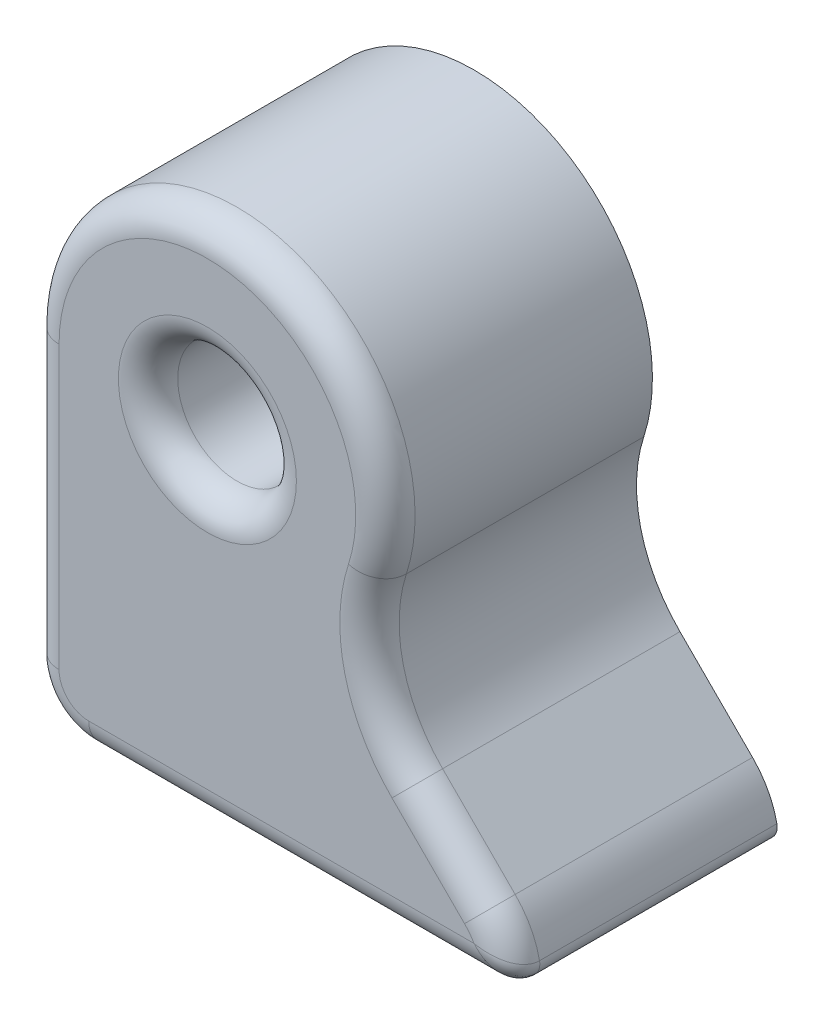
ISO-10303-21;
HEADER;
FILE_DESCRIPTION(('STEP AP214'),'2;1');
FILE_NAME('part.step','',(''),(''),'','','');
FILE_SCHEMA(('AUTOMOTIVE_DESIGN { 1 0 10303 214 1 1 1 1 }'));
ENDSEC;
DATA;
#1=APPLICATION_CONTEXT('core data for automotive mechanical design processes');
#2=APPLICATION_PROTOCOL_DEFINITION('international standard','automotive_design',2000,#1);
#3=PRODUCT_CONTEXT('',#1,'mechanical');
#4=PRODUCT('Part','Part','',(#3));
#5=PRODUCT_RELATED_PRODUCT_CATEGORY('part','',(#4));
#6=PRODUCT_DEFINITION_FORMATION('','',#4);
#7=PRODUCT_DEFINITION_CONTEXT('part definition',#1,'design');
#8=PRODUCT_DEFINITION('design','',#6,#7);
#9=PRODUCT_DEFINITION_SHAPE('','',#8);
#10=(LENGTH_UNIT() NAMED_UNIT(*) SI_UNIT(.MILLI.,.METRE.));
#11=(NAMED_UNIT(*) PLANE_ANGLE_UNIT() SI_UNIT($,.RADIAN.));
#12=(NAMED_UNIT(*) SI_UNIT($,.STERADIAN.) SOLID_ANGLE_UNIT());
#13=UNCERTAINTY_MEASURE_WITH_UNIT(LENGTH_MEASURE(1.E-05),#10,'distance_accuracy_value','');
#14=(GEOMETRIC_REPRESENTATION_CONTEXT(3) GLOBAL_UNCERTAINTY_ASSIGNED_CONTEXT((#13)) GLOBAL_UNIT_ASSIGNED_CONTEXT((#10,
#11,#12)) REPRESENTATION_CONTEXT('',''));
#15=CARTESIAN_POINT('',(0.,0.,0.));
#16=DIRECTION('',(0.,0.,1.));
#17=DIRECTION('',(1.,0.,0.));
#18=AXIS2_PLACEMENT_3D('',#15,#16,#17);
#19=CARTESIAN_POINT('',(-35.,23.,0.));
#20=DIRECTION('',(0.,0.,1.));
#21=DIRECTION('',(1.,0.,0.));
#22=AXIS2_PLACEMENT_3D('',#19,#20,#21);
#23=CYLINDRICAL_SURFACE('',#22,1.6);
#24=CARTESIAN_POINT('',(-35.,23.,0.));
#25=DIRECTION('',(0.,0.,1.));
#26=DIRECTION('',(1.,0.,0.));
#27=AXIS2_PLACEMENT_3D('',#24,#25,#26);
#28=CIRCLE('',#27,1.6);
#29=CARTESIAN_POINT('',(-33.4,23.,0.));
#30=VERTEX_POINT('',#29);
#31=EDGE_CURVE('E211',#30,#30,#28,.T.);
#32=ORIENTED_EDGE('',*,*,#31,.F.);
#33=EDGE_LOOP('',(#32));
#34=FACE_BOUND('',#33,.T.);
#35=CARTESIAN_POINT('',(-35.,23.,4.));
#36=DIRECTION('',(0.,0.,1.));
#37=DIRECTION('',(1.,0.,0.));
#38=AXIS2_PLACEMENT_3D('',#35,#36,#37);
#39=CIRCLE('',#38,1.6);
#40=CARTESIAN_POINT('',(-33.4,23.,4.));
#41=VERTEX_POINT('',#40);
#42=EDGE_CURVE('E346',#41,#41,#39,.F.);
#43=ORIENTED_EDGE('',*,*,#42,.F.);
#44=EDGE_LOOP('',(#43));
#45=FACE_BOUND('',#44,.T.);
#46=ADVANCED_FACE('F37',(#34,#45),#23,.F.);
#47=CARTESIAN_POINT('',(-20.5025253169416,0.,18.));
#48=DIRECTION('',(0.,0.,-1.));
#49=DIRECTION('',(-1.,0.,0.));
#50=AXIS2_PLACEMENT_3D('',#47,#48,#49);
#51=CYLINDRICAL_SURFACE('',#50,6.01219330881983);
#52=DIRECTION('',(0.,0.,-1.));
#53=VECTOR('',#52,1.);
#54=CARTESIAN_POINT('',(-16.2512626584707,4.25126265847091,18.));
#55=LINE('',#54,#53);
#56=CARTESIAN_POINT('',(-16.2512626584707,4.25126265847091,16.));
#57=VERTEX_POINT('',#56);
#58=CARTESIAN_POINT('',(-16.2512626584707,4.25126265847091,0.));
#59=VERTEX_POINT('',#58);
#60=EDGE_CURVE('E125',#57,#59,#55,.T.);
#61=ORIENTED_EDGE('',*,*,#60,.F.);
#62=CARTESIAN_POINT('',(-20.5025253169416,0.,16.));
#63=DIRECTION('',(0.,0.,1.));
#64=DIRECTION('',(1.,0.,0.));
#65=AXIS2_PLACEMENT_3D('',#62,#63,#64);
#66=CIRCLE('',#65,6.01219330881983);
#67=CARTESIAN_POINT('',(-14.6112066312916,1.19951345416792,16.));
#68=VERTEX_POINT('',#67);
#69=EDGE_CURVE('E196',#57,#68,#66,.F.);
#70=ORIENTED_EDGE('',*,*,#69,.T.);
#71=DIRECTION('',(0.,0.,-1.));
#72=VECTOR('',#71,1.);
#73=CARTESIAN_POINT('',(-14.6112066312916,1.19951345416792,18.));
#74=LINE('',#73,#72);
#75=CARTESIAN_POINT('',(-14.6112066312916,1.19951345416792,0.));
#76=VERTEX_POINT('',#75);
#77=EDGE_CURVE('E142',#68,#76,#74,.T.);
#78=ORIENTED_EDGE('',*,*,#77,.T.);
#79=CARTESIAN_POINT('',(-20.5025253169416,0.,0.));
#80=DIRECTION('',(0.,0.,1.));
#81=DIRECTION('',(1.,0.,0.));
#82=AXIS2_PLACEMENT_3D('',#79,#80,#81);
#83=CIRCLE('',#82,6.01219330881983);
#84=EDGE_CURVE('E139',#76,#59,#83,.T.);
#85=ORIENTED_EDGE('',*,*,#84,.T.);
#86=EDGE_LOOP('',(#61,#70,#78,#85));
#87=FACE_BOUND('',#86,.T.);
#88=ADVANCED_FACE('F140',(#87),#51,.T.);
#89=CARTESIAN_POINT('',(-16.2512626584707,4.25126265847091,18.));
#90=DIRECTION('',(-0.707106781186544,-0.707106781186551,0.));
#91=DIRECTION('',(0.707106781186551,-0.707106781186544,0.));
#92=AXIS2_PLACEMENT_3D('',#89,#90,#91);
#93=PLANE('',#92);
#94=DIRECTION('',(0.,0.,1.));
#95=VECTOR('',#94,1.);
#96=CARTESIAN_POINT('',(-21.1435935394489,9.14359353944907,18.));
#97=LINE('',#96,#95);
#98=CARTESIAN_POINT('',(-21.1435935394489,9.14359353944907,0.));
#99=VERTEX_POINT('',#98);
#100=CARTESIAN_POINT('',(-21.1435935394489,9.14359353944907,16.));
#101=VERTEX_POINT('',#100);
#102=EDGE_CURVE('E165',#99,#101,#97,.T.);
#103=ORIENTED_EDGE('',*,*,#102,.T.);
#104=DIRECTION('',(-0.707106781186551,0.707106781186544,0.));
#105=VECTOR('',#104,1.);
#106=CARTESIAN_POINT('',(-16.2512626584707,4.25126265847091,16.));
#107=LINE('',#106,#105);
#108=EDGE_CURVE('E133',#101,#57,#107,.F.);
#109=ORIENTED_EDGE('',*,*,#108,.T.);
#110=ORIENTED_EDGE('',*,*,#60,.T.);
#111=DIRECTION('',(-0.707106781186551,0.707106781186544,0.));
#112=VECTOR('',#111,1.);
#113=CARTESIAN_POINT('',(-16.2512626584707,4.25126265847091,0.));
#114=LINE('',#113,#112);
#115=EDGE_CURVE('E130',#59,#99,#114,.T.);
#116=ORIENTED_EDGE('',*,*,#115,.T.);
#117=EDGE_LOOP('',(#103,#109,#110,#116));
#118=FACE_BOUND('',#117,.T.);
#119=ADVANCED_FACE('F128',(#118),#93,.F.);
#120=CARTESIAN_POINT('',(-35.,23.,18.));
#121=DIRECTION('',(0.,0.,-1.));
#122=DIRECTION('',(-1.,0.,0.));
#123=AXIS2_PLACEMENT_3D('',#120,#121,#122);
#124=CYLINDRICAL_SURFACE('',#123,12.);
#125=DIRECTION('',(0.,0.,-1.));
#126=VECTOR('',#125,1.);
#127=CARTESIAN_POINT('',(-47.,23.,18.));
#128=LINE('',#127,#126);
#129=CARTESIAN_POINT('',(-47.,23.,16.));
#130=VERTEX_POINT('',#129);
#131=CARTESIAN_POINT('',(-47.,23.,0.));
#132=VERTEX_POINT('',#131);
#133=EDGE_CURVE('E136',#130,#132,#128,.T.);
#134=ORIENTED_EDGE('',*,*,#133,.F.);
#135=CARTESIAN_POINT('',(-35.,23.,16.));
#136=DIRECTION('',(0.,0.,1.));
#137=DIRECTION('',(1.,0.,0.));
#138=AXIS2_PLACEMENT_3D('',#135,#136,#137);
#139=CIRCLE('',#138,12.);
#140=CARTESIAN_POINT('',(-23.5850140332274,19.2989061916261,16.));
#141=VERTEX_POINT('',#140);
#142=EDGE_CURVE('E52',#130,#141,#139,.F.);
#143=ORIENTED_EDGE('',*,*,#142,.T.);
#144=DIRECTION('',(0.,0.,-1.));
#145=VECTOR('',#144,1.);
#146=CARTESIAN_POINT('',(-23.5850140332274,19.2989061916261,18.));
#147=LINE('',#146,#145);
#148=CARTESIAN_POINT('',(-23.5850140332274,19.2989061916261,0.));
#149=VERTEX_POINT('',#148);
#150=EDGE_CURVE('E135',#141,#149,#147,.T.);
#151=ORIENTED_EDGE('',*,*,#150,.T.);
#152=CARTESIAN_POINT('',(-35.,23.,0.));
#153=DIRECTION('',(0.,0.,1.));
#154=DIRECTION('',(1.,0.,0.));
#155=AXIS2_PLACEMENT_3D('',#152,#153,#154);
#156=CIRCLE('',#155,12.);
#157=EDGE_CURVE('E151',#149,#132,#156,.T.);
#158=ORIENTED_EDGE('',*,*,#157,.T.);
#159=EDGE_LOOP('',(#134,#143,#151,#158));
#160=FACE_BOUND('',#159,.T.);
#161=ADVANCED_FACE('F309',(#160),#124,.T.);
#162=CARTESIAN_POINT('',(-47.,23.,18.));
#163=DIRECTION('',(1.,0.,0.));
#164=DIRECTION('',(0.,0.,-1.));
#165=AXIS2_PLACEMENT_3D('',#162,#163,#164);
#166=PLANE('',#165);
#167=DIRECTION('',(0.,0.,-1.));
#168=VECTOR('',#167,1.);
#169=CARTESIAN_POINT('',(-47.,4.,18.));
#170=LINE('',#169,#168);
#171=CARTESIAN_POINT('',(-47.,4.,0.));
#172=VERTEX_POINT('',#171);
#173=CARTESIAN_POINT('',(-47.,4.,16.));
#174=VERTEX_POINT('',#173);
#175=EDGE_CURVE('E172',#172,#174,#170,.F.);
#176=ORIENTED_EDGE('',*,*,#175,.T.);
#177=DIRECTION('',(0.,-1.,0.));
#178=VECTOR('',#177,1.);
#179=CARTESIAN_POINT('',(-47.,23.,16.));
#180=LINE('',#179,#178);
#181=EDGE_CURVE('E60',#174,#130,#180,.F.);
#182=ORIENTED_EDGE('',*,*,#181,.T.);
#183=ORIENTED_EDGE('',*,*,#133,.T.);
#184=DIRECTION('',(0.,-1.,0.));
#185=VECTOR('',#184,1.);
#186=CARTESIAN_POINT('',(-47.,23.,0.));
#187=LINE('',#186,#185);
#188=EDGE_CURVE('E154',#132,#172,#187,.T.);
#189=ORIENTED_EDGE('',*,*,#188,.T.);
#190=EDGE_LOOP('',(#176,#182,#183,#189));
#191=FACE_BOUND('',#190,.T.);
#192=ADVANCED_FACE('F305',(#191),#166,.F.);
#193=CARTESIAN_POINT('',(-47.,0.,18.));
#194=DIRECTION('',(0.,1.,0.));
#195=DIRECTION('',(0.,0.,1.));
#196=AXIS2_PLACEMENT_3D('',#193,#194,#195);
#197=PLANE('',#196);
#198=DIRECTION('',(0.,0.,-1.));
#199=VECTOR('',#198,1.);
#200=CARTESIAN_POINT('',(-15.5911017183321,0.,18.));
#201=LINE('',#200,#199);
#202=CARTESIAN_POINT('',(-15.5911017183321,0.,0.));
#203=VERTEX_POINT('',#202);
#204=CARTESIAN_POINT('',(-15.5911017183321,0.,16.));
#205=VERTEX_POINT('',#204);
#206=EDGE_CURVE('E177',#203,#205,#201,.F.);
#207=ORIENTED_EDGE('',*,*,#206,.T.);
#208=DIRECTION('',(1.,0.,0.));
#209=VECTOR('',#208,1.);
#210=CARTESIAN_POINT('',(-43.,0.,16.));
#211=LINE('',#210,#209);
#212=CARTESIAN_POINT('',(-43.,0.,16.));
#213=VERTEX_POINT('',#212);
#214=EDGE_CURVE('E200',#205,#213,#211,.F.);
#215=ORIENTED_EDGE('',*,*,#214,.T.);
#216=DIRECTION('',(0.,0.,-1.));
#217=VECTOR('',#216,1.);
#218=CARTESIAN_POINT('',(-43.,0.,18.));
#219=LINE('',#218,#217);
#220=CARTESIAN_POINT('',(-43.,0.,0.));
#221=VERTEX_POINT('',#220);
#222=EDGE_CURVE('E168',#213,#221,#219,.T.);
#223=ORIENTED_EDGE('',*,*,#222,.T.);
#224=DIRECTION('',(1.,0.,0.));
#225=VECTOR('',#224,1.);
#226=CARTESIAN_POINT('',(-47.,0.,0.));
#227=LINE('',#226,#225);
#228=EDGE_CURVE('E160',#221,#203,#227,.T.);
#229=ORIENTED_EDGE('',*,*,#228,.T.);
#230=EDGE_LOOP('',(#207,#215,#223,#229));
#231=FACE_BOUND('',#230,.T.);
#232=ADVANCED_FACE('F297',(#231),#197,.F.);
#233=CARTESIAN_POINT('',(-20.5025253169416,0.,18.));
#234=DIRECTION('',(0.,0.,1.));
#235=DIRECTION('',(1.,0.,0.));
#236=AXIS2_PLACEMENT_3D('',#233,#234,#235);
#237=PLANE('',#236);
#238=CARTESIAN_POINT('',(-35.,23.,18.));
#239=DIRECTION('',(0.,0.,1.));
#240=DIRECTION('',(1.,0.,0.));
#241=AXIS2_PLACEMENT_3D('',#238,#239,#240);
#242=CIRCLE('',#241,6.);
#243=CARTESIAN_POINT('',(-29.,23.,18.));
#244=VERTEX_POINT('',#243);
#245=EDGE_CURVE('E12',#244,#244,#242,.F.);
#246=ORIENTED_EDGE('',*,*,#245,.T.);
#247=EDGE_LOOP('',(#246));
#248=FACE_BOUND('',#247,.T.);
#249=CARTESIAN_POINT('',(-20.5025253169416,0.,18.));
#250=DIRECTION('',(0.,0.,1.));
#251=DIRECTION('',(1.,0.,0.));
#252=AXIS2_PLACEMENT_3D('',#249,#250,#251);
#253=CIRCLE('',#252,4.01219330881983);
#254=CARTESIAN_POINT('',(-17.024351205811,2.,18.));
#255=VERTEX_POINT('',#254);
#256=CARTESIAN_POINT('',(-17.6654762208438,2.83704909609781,18.));
#257=VERTEX_POINT('',#256);
#258=EDGE_CURVE('E190',#255,#257,#253,.T.);
#259=ORIENTED_EDGE('',*,*,#258,.T.);
#260=DIRECTION('',(-0.707106781186551,0.707106781186544,0.));
#261=VECTOR('',#260,1.);
#262=CARTESIAN_POINT('',(-22.557807101822,7.72937997707596,18.));
#263=LINE('',#262,#261);
#264=CARTESIAN_POINT('',(-22.557807101822,7.72937997707596,18.));
#265=VERTEX_POINT('',#264);
#266=EDGE_CURVE('E192',#257,#265,#263,.T.);
#267=ORIENTED_EDGE('',*,*,#266,.T.);
#268=CARTESIAN_POINT('',(-14.0725257275835,16.2146613513146,18.));
#269=DIRECTION('',(0.,0.,1.));
#270=DIRECTION('',(1.,0.,0.));
#271=AXIS2_PLACEMENT_3D('',#268,#269,#270);
#272=CIRCLE('',#271,12.);
#273=CARTESIAN_POINT('',(-25.4875116943561,19.9157551596885,18.));
#274=VERTEX_POINT('',#273);
#275=EDGE_CURVE('E180',#265,#274,#272,.F.);
#276=ORIENTED_EDGE('',*,*,#275,.T.);
#277=CARTESIAN_POINT('',(-35.,23.,18.));
#278=DIRECTION('',(0.,0.,1.));
#279=DIRECTION('',(1.,0.,0.));
#280=AXIS2_PLACEMENT_3D('',#277,#278,#279);
#281=CIRCLE('',#280,10.);
#282=CARTESIAN_POINT('',(-45.,23.,18.));
#283=VERTEX_POINT('',#282);
#284=EDGE_CURVE('E182',#274,#283,#281,.T.);
#285=ORIENTED_EDGE('',*,*,#284,.T.);
#286=DIRECTION('',(0.,-1.,0.));
#287=VECTOR('',#286,1.);
#288=CARTESIAN_POINT('',(-45.,4.,18.));
#289=LINE('',#288,#287);
#290=CARTESIAN_POINT('',(-45.,4.,18.));
#291=VERTEX_POINT('',#290);
#292=EDGE_CURVE('E184',#283,#291,#289,.T.);
#293=ORIENTED_EDGE('',*,*,#292,.T.);
#294=CARTESIAN_POINT('',(-43.,4.,18.));
#295=DIRECTION('',(0.,0.,1.));
#296=DIRECTION('',(1.,0.,0.));
#297=AXIS2_PLACEMENT_3D('',#294,#295,#296);
#298=CIRCLE('',#297,2.);
#299=CARTESIAN_POINT('',(-43.,2.,18.));
#300=VERTEX_POINT('',#299);
#301=EDGE_CURVE('E186',#291,#300,#298,.T.);
#302=ORIENTED_EDGE('',*,*,#301,.T.);
#303=DIRECTION('',(1.,0.,0.));
#304=VECTOR('',#303,1.);
#305=CARTESIAN_POINT('',(-15.5911017183321,2.,18.));
#306=LINE('',#305,#304);
#307=EDGE_CURVE('E188',#300,#255,#306,.T.);
#308=ORIENTED_EDGE('',*,*,#307,.T.);
#309=EDGE_LOOP('',(#259,#267,#276,#285,#293,#302,#308));
#310=FACE_BOUND('',#309,.T.);
#311=ADVANCED_FACE('F294',(#248,#310),#237,.T.);
#312=CARTESIAN_POINT('',(-20.5025253169416,0.,0.));
#313=DIRECTION('',(0.,0.,1.));
#314=DIRECTION('',(1.,0.,0.));
#315=AXIS2_PLACEMENT_3D('',#312,#313,#314);
#316=PLANE('',#315);
#317=ORIENTED_EDGE('',*,*,#31,.T.);
#318=EDGE_LOOP('',(#317));
#319=FACE_BOUND('',#318,.T.);
#320=ORIENTED_EDGE('',*,*,#84,.F.);
#321=CARTESIAN_POINT('',(-15.5911017183321,1.,0.));
#322=DIRECTION('',(0.,0.,1.));
#323=DIRECTION('',(1.,0.,0.));
#324=AXIS2_PLACEMENT_3D('',#321,#322,#323);
#325=CIRCLE('',#324,1.);
#326=EDGE_CURVE('E175',#76,#203,#325,.F.);
#327=ORIENTED_EDGE('',*,*,#326,.T.);
#328=ORIENTED_EDGE('',*,*,#228,.F.);
#329=CARTESIAN_POINT('',(-43.,4.,0.));
#330=DIRECTION('',(0.,0.,1.));
#331=DIRECTION('',(1.,0.,0.));
#332=AXIS2_PLACEMENT_3D('',#329,#330,#331);
#333=CIRCLE('',#332,4.);
#334=EDGE_CURVE('E170',#221,#172,#333,.F.);
#335=ORIENTED_EDGE('',*,*,#334,.T.);
#336=ORIENTED_EDGE('',*,*,#188,.F.);
#337=ORIENTED_EDGE('',*,*,#157,.F.);
#338=CARTESIAN_POINT('',(-14.0725257275835,16.2146613513146,0.));
#339=DIRECTION('',(0.,0.,1.));
#340=DIRECTION('',(1.,0.,0.));
#341=AXIS2_PLACEMENT_3D('',#338,#339,#340);
#342=CIRCLE('',#341,10.);
#343=EDGE_CURVE('E150',#149,#99,#342,.T.);
#344=ORIENTED_EDGE('',*,*,#343,.T.);
#345=ORIENTED_EDGE('',*,*,#115,.F.);
#346=EDGE_LOOP('',(#320,#327,#328,#335,#336,#337,#344,#345));
#347=FACE_BOUND('',#346,.T.);
#348=ADVANCED_FACE('F147',(#319,#347),#316,.F.);
#349=CARTESIAN_POINT('',(-14.0725257275835,16.2146613513146,18.));
#350=DIRECTION('',(0.,0.,-1.));
#351=DIRECTION('',(-1.,0.,0.));
#352=AXIS2_PLACEMENT_3D('',#349,#350,#351);
#353=CYLINDRICAL_SURFACE('',#352,10.);
#354=ORIENTED_EDGE('',*,*,#150,.F.);
#355=CARTESIAN_POINT('',(-14.0725257275835,16.2146613513146,16.));
#356=DIRECTION('',(0.,0.,1.));
#357=DIRECTION('',(1.,0.,0.));
#358=AXIS2_PLACEMENT_3D('',#355,#356,#357);
#359=CIRCLE('',#358,10.);
#360=EDGE_CURVE('E206',#141,#101,#359,.T.);
#361=ORIENTED_EDGE('',*,*,#360,.T.);
#362=ORIENTED_EDGE('',*,*,#102,.F.);
#363=ORIENTED_EDGE('',*,*,#343,.F.);
#364=EDGE_LOOP('',(#354,#361,#362,#363));
#365=FACE_BOUND('',#364,.T.);
#366=ADVANCED_FACE('F301',(#365),#353,.F.);
#367=CARTESIAN_POINT('',(-43.,4.,18.));
#368=DIRECTION('',(0.,0.,-1.));
#369=DIRECTION('',(-1.,0.,0.));
#370=AXIS2_PLACEMENT_3D('',#367,#368,#369);
#371=CYLINDRICAL_SURFACE('',#370,4.);
#372=ORIENTED_EDGE('',*,*,#222,.F.);
#373=CARTESIAN_POINT('',(-43.,4.,16.));
#374=DIRECTION('',(0.,0.,1.));
#375=DIRECTION('',(1.,0.,0.));
#376=AXIS2_PLACEMENT_3D('',#373,#374,#375);
#377=CIRCLE('',#376,4.);
#378=EDGE_CURVE('E202',#213,#174,#377,.F.);
#379=ORIENTED_EDGE('',*,*,#378,.T.);
#380=ORIENTED_EDGE('',*,*,#175,.F.);
#381=ORIENTED_EDGE('',*,*,#334,.F.);
#382=EDGE_LOOP('',(#372,#379,#380,#381));
#383=FACE_BOUND('',#382,.T.);
#384=ADVANCED_FACE('F277',(#383),#371,.T.);
#385=CARTESIAN_POINT('',(-15.5911017183321,1.,18.));
#386=DIRECTION('',(0.,0.,-1.));
#387=DIRECTION('',(-1.,0.,0.));
#388=AXIS2_PLACEMENT_3D('',#385,#386,#387);
#389=CYLINDRICAL_SURFACE('',#388,1.);
#390=ORIENTED_EDGE('',*,*,#77,.F.);
#391=CARTESIAN_POINT('',(-15.5911017183321,1.,16.));
#392=DIRECTION('',(0.,0.,-1.));
#393=DIRECTION('',(-1.,0.,0.));
#394=AXIS2_PLACEMENT_3D('',#391,#392,#393);
#395=CIRCLE('',#394,1.);
#396=EDGE_CURVE('E198',#68,#205,#395,.T.);
#397=ORIENTED_EDGE('',*,*,#396,.T.);
#398=ORIENTED_EDGE('',*,*,#206,.F.);
#399=ORIENTED_EDGE('',*,*,#326,.F.);
#400=EDGE_LOOP('',(#390,#397,#398,#399));
#401=FACE_BOUND('',#400,.T.);
#402=ADVANCED_FACE('F272',(#401),#389,.T.);
#403=CARTESIAN_POINT('',(-43.,4.,16.));
#404=DIRECTION('',(0.,0.,1.));
#405=DIRECTION('',(1.,0.,0.));
#406=AXIS2_PLACEMENT_3D('',#403,#404,#405);
#407=DEGENERATE_TOROIDAL_SURFACE('',#406,2.,2.,.T.);
#408=CARTESIAN_POINT('',(-45.,4.,16.));
#409=DIRECTION('',(0.,1.,0.));
#410=DIRECTION('',(0.,0.,1.));
#411=AXIS2_PLACEMENT_3D('',#408,#409,#410);
#412=CIRCLE('',#411,2.);
#413=EDGE_CURVE('E264',#174,#291,#412,.T.);
#414=ORIENTED_EDGE('',*,*,#413,.F.);
#415=ORIENTED_EDGE('',*,*,#378,.F.);
#416=CARTESIAN_POINT('',(-43.,2.,16.));
#417=DIRECTION('',(1.,0.,0.));
#418=DIRECTION('',(0.,0.,-1.));
#419=AXIS2_PLACEMENT_3D('',#416,#417,#418);
#420=CIRCLE('',#419,2.);
#421=EDGE_CURVE('E145',#300,#213,#420,.T.);
#422=ORIENTED_EDGE('',*,*,#421,.F.);
#423=ORIENTED_EDGE('',*,*,#301,.F.);
#424=EDGE_LOOP('',(#414,#415,#422,#423));
#425=FACE_BOUND('',#424,.T.);
#426=ADVANCED_FACE('F251',(#425),#407,.T.);
#427=CARTESIAN_POINT('',(-20.5025253169416,2.,16.));
#428=DIRECTION('',(-1.,0.,0.));
#429=DIRECTION('',(0.,0.,1.));
#430=AXIS2_PLACEMENT_3D('',#427,#428,#429);
#431=CYLINDRICAL_SURFACE('',#430,2.);
#432=ORIENTED_EDGE('',*,*,#421,.T.);
#433=ORIENTED_EDGE('',*,*,#214,.F.);
#434=CARTESIAN_POINT('',(-14.6787131685003,1.23044059383151,15.5145169943439));
#435=CARTESIAN_POINT('',(-14.5298068118896,0.139616623319057,15.1956100892063));
#436=CARTESIAN_POINT('',(-15.6278515354826,0.059817985028431,15.5145169943439));
#437=CARTESIAN_POINT('',(-14.6677862511741,1.22547175654482,15.5531292461057));
#438=CARTESIAN_POINT('',(-14.5049855802317,0.118396434801315,15.2532693322458));
#439=CARTESIAN_POINT('',(-15.6218921980786,0.0501539096203975,15.5531292460271));
#440=CARTESIAN_POINT('',(-14.6580730083994,1.22103746089802,15.5924080611884));
#441=CARTESIAN_POINT('',(-14.4823514655232,0.0990161061543352,15.3137543403074));
#442=CARTESIAN_POINT('',(-15.616599851799,0.0415546863410762,15.5924080610997));
#443=CARTESIAN_POINT('',(-14.6412489214242,1.21333788038213,15.6720705428564));
#444=CARTESIAN_POINT('',(-14.4421969707719,0.0646011681017317,15.4404199223793));
#445=CARTESIAN_POINT('',(-15.607438656047,0.026650777006536,15.6720705427967));
#446=CARTESIAN_POINT('',(-14.6341394883065,1.21007322939944,15.7124547958092));
#447=CARTESIAN_POINT('',(-14.4247836592059,0.0496579475052004,15.5064839011187));
#448=CARTESIAN_POINT('',(-15.6035705784224,0.0203473351145101,15.7124547957889));
#449=CARTESIAN_POINT('',(-14.6170583306891,1.20221988484989,15.8344116391119));
#450=CARTESIAN_POINT('',(-14.3821405728502,0.0130466765518029,15.7114252581752));
#451=CARTESIAN_POINT('',(-15.5942799106218,0.00519786468321076,15.8344116391523));
#452=CARTESIAN_POINT('',(-14.611210105536,1.19951512921128,15.917217359387));
#453=CARTESIAN_POINT('',(-14.3669861498799,7.65136648300338E-06,15.8552192308811));
#454=CARTESIAN_POINT('',(-15.5911035839364,3.11876951992782E-06,15.9172173593926));
#455=CARTESIAN_POINT('',(-14.6112031493825,1.19951177542914,16.0829652730951));
#456=CARTESIAN_POINT('',(-14.366968531253,-7.66828129837483E-06,16.145100834812));
#457=CARTESIAN_POINT('',(-15.5910998486119,-3.12565005205497E-06,16.0829652730895));
#458=CARTESIAN_POINT('',(-14.617070235844,1.20222511734636,16.1659073645805));
#459=CARTESIAN_POINT('',(-14.3821722618726,0.013073622109566,16.2891443977445));
#460=CARTESIAN_POINT('',(-15.5942864622178,0.00520830832470139,16.1659073645987));
#461=CARTESIAN_POINT('',(-14.6399281445754,1.2127349084373,16.3286393242624));
#462=CARTESIAN_POINT('',(-14.4390422551988,0.0618999528168503,16.5616261614138));
#463=CARTESIAN_POINT('',(-15.6067190268552,0.0254814782673692,16.3286393242442));
#464=CARTESIAN_POINT('',(-14.6569163263081,1.2205301509882,16.408429935963));
#465=CARTESIAN_POINT('',(-14.4800028731273,0.0970399002050203,16.6885820373033));
#466=CARTESIAN_POINT('',(-15.6159635395301,0.0405408759832803,16.4084299358849));
#467=CARTESIAN_POINT('',(-14.7003416008638,1.24027446521703,16.5619407370817));
#468=CARTESIAN_POINT('',(-14.5780795451588,0.180884339275679,16.916637309823));
#469=CARTESIAN_POINT('',(-15.6396476807283,0.0789461525616086,16.5619407371591));
#470=CARTESIAN_POINT('',(-14.7267046740482,1.25219097764851,16.6357030654429));
#471=CARTESIAN_POINT('',(-14.6342651129541,0.228800818295988,17.0174891155297));
#472=CARTESIAN_POINT('',(-15.654046618153,0.102227108256646,16.6357030657337));
#473=CARTESIAN_POINT('',(-14.7871233968188,1.2791797676912,16.7766830605792));
#474=CARTESIAN_POINT('',(-14.7536400503864,0.330114770629992,17.1944802178282));
#475=CARTESIAN_POINT('',(-15.6871427346207,0.155425305060125,16.7766830608842));
#476=CARTESIAN_POINT('',(-14.8211882183525,1.29425580637884,16.8438927862034));
#477=CARTESIAN_POINT('',(-14.8163497375588,0.383117756114256,17.2708646526085));
#478=CARTESIAN_POINT('',(-15.7058450389818,0.185350457917165,16.8438927863088));
#479=CARTESIAN_POINT('',(-14.9125914642586,1.33412892656535,17.0010197166211));
#480=CARTESIAN_POINT('',(-14.9710966839466,0.513083646417618,17.4329513757946));
#481=CARTESIAN_POINT('',(-15.7562070331676,0.265366157305099,17.0010197164665));
#482=CARTESIAN_POINT('',(-14.9733766717734,1.36018147955415,17.086917321668));
#483=CARTESIAN_POINT('',(-15.064430182979,0.590803166963271,17.5094236898869));
#484=CARTESIAN_POINT('',(-15.7898428421481,0.318354133599782,17.0869173215615));
#485=CARTESIAN_POINT('',(-15.1034932907625,1.41451657679647,17.2441677465158));
#486=CARTESIAN_POINT('',(-15.2454361860915,0.739673823496322,17.6337088102494));
#487=CARTESIAN_POINT('',(-15.8623157298533,0.431100908952036,17.2441677464708));
#488=CARTESIAN_POINT('',(-15.1728417703681,1.44280353284939,17.3154907405711));
#489=CARTESIAN_POINT('',(-15.3334697145977,0.811199714859829,17.6827776247997));
#490=CARTESIAN_POINT('',(-15.9011632101326,0.490873210587918,17.3154907405396));
#491=CARTESIAN_POINT('',(-15.3571915448742,1.51576559164648,17.4810517646699));
#492=CARTESIAN_POINT('',(-15.5478421489333,0.982748921787993,17.7848444515394));
#493=CARTESIAN_POINT('',(-16.0052189378952,0.648731720704458,17.4810517647189));
#494=CARTESIAN_POINT('',(-15.4761143150074,1.56079679465774,17.5659401734189));
#495=CARTESIAN_POINT('',(-15.6735452341096,1.08097307688337,17.8289762046873));
#496=CARTESIAN_POINT('',(-16.0730621050568,0.749621773288561,17.5659401735606));
#497=CARTESIAN_POINT('',(-15.7201287412702,1.64816016289067,17.7094901713111));
#498=CARTESIAN_POINT('',(-15.9124706204862,1.26238811145987,17.8960053285957));
#499=CARTESIAN_POINT('',(-16.2142700468434,0.954391279615368,17.709490171169));
#500=CARTESIAN_POINT('',(-15.8452347388775,1.69048547571273,17.7680872739484));
#501=CARTESIAN_POINT('',(-16.0276369531742,1.34728819106882,17.9201919936943));
#502=CARTESIAN_POINT('',(-16.287647887878,1.05827742568259,17.7680872734286));
#503=CARTESIAN_POINT('',(-16.1460038943823,1.78575311002661,17.8821093759717));
#504=CARTESIAN_POINT('',(-16.2912852825041,1.53540044950472,17.9633923540781));
#505=CARTESIAN_POINT('',(-16.467002937159,1.30525689139944,17.8821093766919));
#506=CARTESIAN_POINT('',(-16.322566531967,1.83649914189269,17.927605219831));
#507=CARTESIAN_POINT('',(-16.4411859522877,1.63748457313822,17.9784697481621));
#508=CARTESIAN_POINT('',(-16.5746434047359,1.44802756968287,17.9276052229941));
#509=CARTESIAN_POINT('',(-16.6724551365649,1.9262688074288,17.9863046417514));
#510=CARTESIAN_POINT('',(-16.7317694118974,1.82554241807793,17.9964933372232));
#511=CARTESIAN_POINT('',(-16.7939232061847,1.72655756479531,17.9863046445755));
#512=CARTESIAN_POINT('',(-16.8457844931748,1.96530544936709,17.9995441715758));
#513=CARTESIAN_POINT('',(-16.8756472515617,1.91380069687555,17.9998847454869));
#514=CARTESIAN_POINT('',(-16.9055579471768,1.86232452230533,17.9995441716237));
#515=CARTESIAN_POINT('',(-17.0184645580906,1.99886093182083,17.999996122661));
#516=CARTESIAN_POINT('',(-17.019448189379,1.99716208237972,17.9999990364054));
#517=CARTESIAN_POINT('',(-17.0204318465049,1.99546323422695,17.9999961226601));
#518=CARTESIAN_POINT('',(-17.0214084283664,1.99943137765047,17.9999999786138));
#519=CARTESIAN_POINT('',(-17.021899875833,1.99858187151584,18.0000000035435));
#520=CARTESIAN_POINT('',(-17.0223913355155,1.99773235832982,17.999999978613));
#521=CARTESIAN_POINT('',(-17.024351205811,2.,18.));
#522=CARTESIAN_POINT('',(-17.024351205811,2.,18.));
#523=CARTESIAN_POINT('',(-17.024351205811,2.,18.));
#524=(BOUNDED_SURFACE() B_SPLINE_SURFACE(3,2,((#434,#435,#436),(#437,#438,#439),(#440,#441,
#442),(#443,#444,#445),(#446,#447,#448),(#449,#450,#451),(#452,#453,#454),(#455,#456,#457),
(#458,#459,#460),(#461,#462,#463),(#464,#465,#466),(#467,#468,#469),(#470,#471,#472),(#473,#474,
#475),(#476,#477,#478),(#479,#480,#481),(#482,#483,#484),(#485,#486,#487),(#488,#489,#490),
(#491,#492,#493),(#494,#495,#496),(#497,#498,#499),(#500,#501,#502),(#503,#504,#505),(#506,#507,
#508),(#509,#510,#511),(#512,#513,#514),(#515,#516,#517),(#518,#519,#520),(#521,#522,#523)),
.UNSPECIFIED.,.F.,.F.,.F.) B_SPLINE_SURFACE_WITH_KNOTS((4,2,2,2,2,2,2,2,2,2,2,2,2,2,4),(3,3),
(0.,0.0622889704455207,0.124611647381802,0.248573787107558,0.372809408243044,0.497015542189543,
0.620262017229565,0.743656045871464,0.924571123043894,1.10585280011089,1.3880615718038,
1.67095880233554,2.06290226394139,2.45440867877564,2.46120142591503),(0.,1.),
.UNSPECIFIED.) GEOMETRIC_REPRESENTATION_ITEM() RATIONAL_B_SPLINE_SURFACE(((1.,0.657415216602334,
1.),(1.,0.653531656980684,1.),(1.,0.650021670691629,1.),(1.,0.64387807423698,1.),(1.,
0.641244939333448,1.),(1.,0.634884002307049,1.),(1.,0.632649252996825,1.),(1.,0.632646397711946,
1.),(1.,0.634888156783555,1.),(1.,0.643400913847109,1.),(1.,0.649670955377308,1.),(1.,
0.665099643026755,1.),(1.,0.674235596504301,1.),(1.,0.694244919693369,1.),(1.,0.705120356385828,
1.),(1.,0.732850883475143,1.),(1.,0.750130171402,1.),(1.,0.784214696435299,1.),(1.,
0.801018901990572,1.),(1.,0.841993802111934,1.),(1.,0.865057072949392,1.),(1.,0.905865631883221,
1.),(1.,0.923597809304648,1.),(1.,0.959232109172425,1.),(1.,0.974565070425247,1.),(1.,
0.994857756424711,1.),(1.,0.999829029054143,1.),(1.,0.999998554833129,1.),(1.,0.999999999639636,
1.),(1.,1.,1.))) REPRESENTATION_ITEM('') SURFACE());
#525=CARTESIAN_POINT('',(-15.6278515354826,0.059817985028431,15.5145169943439));
#526=CARTESIAN_POINT('',(-15.6218921980786,0.0501539096203975,15.5531292460271));
#527=CARTESIAN_POINT('',(-15.616599851799,0.0415546863410762,15.5924080610997));
#528=CARTESIAN_POINT('',(-15.607438656047,0.026650777006536,15.6720705427967));
#529=CARTESIAN_POINT('',(-15.6035705784224,0.0203473351145101,15.7124547957889));
#530=CARTESIAN_POINT('',(-15.5942799106218,0.00519786468321076,15.8344116391523));
#531=CARTESIAN_POINT('',(-15.5911035839364,3.11876951992266E-06,15.9172173593926));
#532=CARTESIAN_POINT('',(-15.5910998486119,-3.1256500520498E-06,16.0829652730895));
#533=CARTESIAN_POINT('',(-15.5942864622178,0.0052083083247014,16.1659073645987));
#534=CARTESIAN_POINT('',(-15.6067190268552,0.0254814782673692,16.3286393242442));
#535=CARTESIAN_POINT('',(-15.6159635395301,0.0405408759832803,16.4084299358849));
#536=CARTESIAN_POINT('',(-15.6396476807283,0.0789461525616086,16.5619407371591));
#537=CARTESIAN_POINT('',(-15.654046618153,0.102227108256646,16.6357030657337));
#538=CARTESIAN_POINT('',(-15.6871427346207,0.155425305060125,16.7766830608842));
#539=CARTESIAN_POINT('',(-15.7058450389818,0.185350457917165,16.8438927863088));
#540=CARTESIAN_POINT('',(-15.7562070331676,0.265366157305099,17.0010197164665));
#541=CARTESIAN_POINT('',(-15.7898428421481,0.318354133599782,17.0869173215615));
#542=CARTESIAN_POINT('',(-15.8623157298533,0.431100908952036,17.2441677464708));
#543=CARTESIAN_POINT('',(-15.9011632101326,0.490873210587918,17.3154907405396));
#544=CARTESIAN_POINT('',(-16.0052189378952,0.648731720704458,17.4810517647189));
#545=CARTESIAN_POINT('',(-16.0730621050568,0.749621773288562,17.5659401735606));
#546=CARTESIAN_POINT('',(-16.2142700468434,0.954391279615368,17.709490171169));
#547=CARTESIAN_POINT('',(-16.287647887878,1.05827742568259,17.7680872734286));
#548=CARTESIAN_POINT('',(-16.467002937159,1.30525689139944,17.8821093766919));
#549=CARTESIAN_POINT('',(-16.574643404736,1.44802756968288,17.9276052229941));
#550=CARTESIAN_POINT('',(-16.7939232061847,1.7265575647953,17.9863046445755));
#551=CARTESIAN_POINT('',(-16.9055579471767,1.86232452230533,17.9995441716237));
#552=CARTESIAN_POINT('',(-17.0204318465049,1.99546323422695,17.9999961226601));
#553=CARTESIAN_POINT('',(-17.0223913355155,1.99773235832982,17.999999978613));
#554=CARTESIAN_POINT('',(-17.024351205811,2.,18.));
#555=B_SPLINE_CURVE_WITH_KNOTS('',3,(#525,#526,#527,#528,#529,#530,#531,#532,#533,#534,#535,
#536,#537,#538,#539,#540,#541,#542,#543,#544,#545,#546,#547,#548,#549,#550,#551,#552,#553,#554),
.UNSPECIFIED.,.F.,.F.,(4,2,2,2,2,2,2,2,2,2,2,2,2,2,4),(0.,0.0622889704455207,0.124611647381802,
0.248573787107558,0.372809408243044,0.497015542189543,0.620262017229565,0.743656045871464,
0.924571123043894,1.10585280011089,1.3880615718038,1.67095880233554,2.06290226394139,
2.45440867877564,2.46120142591503),.UNSPECIFIED.);
#556=EDGE_CURVE('E256',#255,#205,#555,.F.);
#557=ORIENTED_EDGE('',*,*,#556,.F.);
#558=ORIENTED_EDGE('',*,*,#307,.F.);
#559=EDGE_LOOP('',(#432,#433,#557,#558));
#560=FACE_BOUND('',#559,.T.);
#561=ADVANCED_FACE('F246',(#560),#431,.T.);
#562=CARTESIAN_POINT('',(-45.,0.,16.));
#563=DIRECTION('',(0.,1.,0.));
#564=DIRECTION('',(0.,0.,1.));
#565=AXIS2_PLACEMENT_3D('',#562,#563,#564);
#566=CYLINDRICAL_SURFACE('',#565,2.);
#567=ORIENTED_EDGE('',*,*,#413,.T.);
#568=ORIENTED_EDGE('',*,*,#292,.F.);
#569=CARTESIAN_POINT('',(-45.,23.,16.));
#570=DIRECTION('',(0.,1.,0.));
#571=DIRECTION('',(0.,0.,1.));
#572=AXIS2_PLACEMENT_3D('',#569,#570,#571);
#573=CIRCLE('',#572,2.);
#574=EDGE_CURVE('E225',#130,#283,#573,.T.);
#575=ORIENTED_EDGE('',*,*,#574,.F.);
#576=ORIENTED_EDGE('',*,*,#181,.F.);
#577=EDGE_LOOP('',(#567,#568,#575,#576));
#578=FACE_BOUND('',#577,.T.);
#579=ADVANCED_FACE('F250',(#578),#566,.T.);
#580=ORIENTED_EDGE('',*,*,#556,.T.);
#581=ORIENTED_EDGE('',*,*,#396,.F.);
#582=CARTESIAN_POINT('',(-14.6787131685003,1.23044059383151,15.5145169943439));
#583=CARTESIAN_POINT('',(-14.6677862511741,1.22547175654482,15.5531292461057));
#584=CARTESIAN_POINT('',(-14.6580730083994,1.22103746089802,15.5924080611884));
#585=CARTESIAN_POINT('',(-14.6412489214242,1.21333788038213,15.6720705428564));
#586=CARTESIAN_POINT('',(-14.6341394883065,1.21007322939944,15.7124547958092));
#587=CARTESIAN_POINT('',(-14.6170583306891,1.20221988484989,15.8344116391119));
#588=CARTESIAN_POINT('',(-14.611210105536,1.19951512921128,15.917217359387));
#589=CARTESIAN_POINT('',(-14.6112031493825,1.19951177542914,16.0829652730951));
#590=CARTESIAN_POINT('',(-14.617070235844,1.20222511734636,16.1659073645805));
#591=CARTESIAN_POINT('',(-14.6399281445754,1.2127349084373,16.3286393242624));
#592=CARTESIAN_POINT('',(-14.6569163263081,1.2205301509882,16.408429935963));
#593=CARTESIAN_POINT('',(-14.7003416008638,1.24027446521703,16.5619407370817));
#594=CARTESIAN_POINT('',(-14.7267046740482,1.25219097764851,16.6357030654429));
#595=CARTESIAN_POINT('',(-14.7871233968188,1.2791797676912,16.7766830605792));
#596=CARTESIAN_POINT('',(-14.8211882183525,1.29425580637884,16.8438927862034));
#597=CARTESIAN_POINT('',(-14.9125914642586,1.33412892656535,17.0010197166211));
#598=CARTESIAN_POINT('',(-14.9733766717734,1.36018147955415,17.086917321668));
#599=CARTESIAN_POINT('',(-15.1034932907625,1.41451657679647,17.2441677465158));
#600=CARTESIAN_POINT('',(-15.1728417703681,1.44280353284939,17.3154907405711));
#601=CARTESIAN_POINT('',(-15.3571915448742,1.51576559164648,17.4810517646699));
#602=CARTESIAN_POINT('',(-15.4761143150074,1.56079679465774,17.5659401734189));
#603=CARTESIAN_POINT('',(-15.7201287412702,1.64816016289067,17.7094901713111));
#604=CARTESIAN_POINT('',(-15.8452347388775,1.69048547571273,17.7680872739484));
#605=CARTESIAN_POINT('',(-16.1460038943823,1.78575311002661,17.8821093759717));
#606=CARTESIAN_POINT('',(-16.322566531967,1.8364991418927,17.9276052198309));
#607=CARTESIAN_POINT('',(-16.6724551365649,1.9262688074288,17.9863046417514));
#608=CARTESIAN_POINT('',(-16.8457844931748,1.96530544936709,17.9995441715758));
#609=CARTESIAN_POINT('',(-17.0184645580906,1.99886093182083,17.999996122661));
#610=CARTESIAN_POINT('',(-17.0214084283664,1.99943137765047,17.9999999786138));
#611=CARTESIAN_POINT('',(-17.024351205811,2.,18.));
#612=B_SPLINE_CURVE_WITH_KNOTS('',3,(#582,#583,#584,#585,#586,#587,#588,#589,#590,#591,#592,
#593,#594,#595,#596,#597,#598,#599,#600,#601,#602,#603,#604,#605,#606,#607,#608,#609,#610,#611),
.UNSPECIFIED.,.F.,.F.,(4,2,2,2,2,2,2,2,2,2,2,2,2,2,4),(0.,0.0622889704455207,0.124611647381802,
0.248573787107558,0.372809408243044,0.497015542189543,0.620262017229565,0.743656045871464,
0.924571123043894,1.10585280011089,1.3880615718038,1.67095880233554,2.06290226394139,
2.45440867877564,2.46120142591503),.UNSPECIFIED.);
#613=EDGE_CURVE('E216',#255,#68,#612,.F.);
#614=ORIENTED_EDGE('',*,*,#613,.F.);
#615=EDGE_LOOP('',(#580,#581,#614));
#616=FACE_BOUND('',#615,.T.);
#617=ADVANCED_FACE('F244',(#616),#524,.T.);
#618=CARTESIAN_POINT('',(-35.,23.,16.));
#619=DIRECTION('',(0.,0.,1.));
#620=DIRECTION('',(1.,0.,0.));
#621=AXIS2_PLACEMENT_3D('',#618,#619,#620);
#622=TOROIDAL_SURFACE('',#621,10.,2.);
#623=ORIENTED_EDGE('',*,*,#574,.T.);
#624=ORIENTED_EDGE('',*,*,#284,.F.);
#625=CARTESIAN_POINT('',(-25.4875116943561,19.9157551596885,16.));
#626=DIRECTION('',(-0.308424484031157,-0.951248830564387,0.));
#627=DIRECTION('',(0.951248830564388,-0.308424484031157,0.));
#628=AXIS2_PLACEMENT_3D('',#625,#626,#627);
#629=CIRCLE('',#628,2.);
#630=EDGE_CURVE('E213',#141,#274,#629,.T.);
#631=ORIENTED_EDGE('',*,*,#630,.F.);
#632=ORIENTED_EDGE('',*,*,#142,.F.);
#633=EDGE_LOOP('',(#623,#624,#631,#632));
#634=FACE_BOUND('',#633,.T.);
#635=ADVANCED_FACE('F242',(#634),#622,.T.);
#636=CARTESIAN_POINT('',(-20.5025253169416,0.,16.));
#637=DIRECTION('',(0.,0.,1.));
#638=DIRECTION('',(1.,0.,0.));
#639=AXIS2_PLACEMENT_3D('',#636,#637,#638);
#640=TOROIDAL_SURFACE('',#639,4.01219330881983,2.);
#641=ORIENTED_EDGE('',*,*,#613,.T.);
#642=ORIENTED_EDGE('',*,*,#69,.F.);
#643=CARTESIAN_POINT('',(-17.6654762208438,2.83704909609781,16.));
#644=DIRECTION('',(-0.707106781186552,0.707106781186543,0.));
#645=DIRECTION('',(-0.707106781186543,-0.707106781186552,0.));
#646=AXIS2_PLACEMENT_3D('',#643,#644,#645);
#647=CIRCLE('',#646,2.);
#648=EDGE_CURVE('E210',#257,#57,#647,.T.);
#649=ORIENTED_EDGE('',*,*,#648,.F.);
#650=ORIENTED_EDGE('',*,*,#258,.F.);
#651=EDGE_LOOP('',(#641,#642,#649,#650));
#652=FACE_BOUND('',#651,.T.);
#653=ADVANCED_FACE('F237',(#652),#640,.T.);
#654=CARTESIAN_POINT('',(-14.0725257275835,16.2146613513146,16.));
#655=DIRECTION('',(0.,0.,1.));
#656=DIRECTION('',(1.,0.,0.));
#657=AXIS2_PLACEMENT_3D('',#654,#655,#656);
#658=TOROIDAL_SURFACE('',#657,12.,2.);
#659=ORIENTED_EDGE('',*,*,#630,.T.);
#660=ORIENTED_EDGE('',*,*,#275,.F.);
#661=CARTESIAN_POINT('',(-22.557807101822,7.72937997707596,16.));
#662=DIRECTION('',(0.707106781186552,-0.707106781186543,0.));
#663=DIRECTION('',(0.707106781186543,0.707106781186552,0.));
#664=AXIS2_PLACEMENT_3D('',#661,#662,#663);
#665=CIRCLE('',#664,2.);
#666=EDGE_CURVE('E208',#101,#265,#665,.T.);
#667=ORIENTED_EDGE('',*,*,#666,.F.);
#668=ORIENTED_EDGE('',*,*,#360,.F.);
#669=EDGE_LOOP('',(#659,#660,#667,#668));
#670=FACE_BOUND('',#669,.T.);
#671=ADVANCED_FACE('F241',(#670),#658,.T.);
#672=CARTESIAN_POINT('',(-17.6654762208438,2.83704909609781,16.));
#673=DIRECTION('',(0.707106781186551,-0.707106781186544,0.));
#674=DIRECTION('',(0.707106781186544,0.707106781186551,0.));
#675=AXIS2_PLACEMENT_3D('',#672,#673,#674);
#676=CYLINDRICAL_SURFACE('',#675,2.);
#677=ORIENTED_EDGE('',*,*,#648,.T.);
#678=ORIENTED_EDGE('',*,*,#108,.F.);
#679=ORIENTED_EDGE('',*,*,#666,.T.);
#680=ORIENTED_EDGE('',*,*,#266,.F.);
#681=EDGE_LOOP('',(#677,#678,#679,#680));
#682=FACE_BOUND('',#681,.T.);
#683=ADVANCED_FACE('F320',(#682),#676,.T.);
#684=CARTESIAN_POINT('',(-20.5025253169416,0.,4.));
#685=DIRECTION('',(0.,0.,1.));
#686=DIRECTION('',(1.,0.,0.));
#687=AXIS2_PLACEMENT_3D('',#684,#685,#686);
#688=PLANE('',#687);
#689=CARTESIAN_POINT('',(-35.,23.,4.));
#690=DIRECTION('',(0.,0.,1.));
#691=DIRECTION('',(1.,0.,0.));
#692=AXIS2_PLACEMENT_3D('',#689,#690,#691);
#693=CIRCLE('',#692,4.);
#694=CARTESIAN_POINT('',(-31.,23.,4.));
#695=VERTEX_POINT('',#694);
#696=EDGE_CURVE('E348',#695,#695,#693,.F.);
#697=ORIENTED_EDGE('',*,*,#696,.F.);
#698=EDGE_LOOP('',(#697));
#699=FACE_BOUND('',#698,.T.);
#700=ORIENTED_EDGE('',*,*,#42,.T.);
#701=EDGE_LOOP('',(#700));
#702=FACE_BOUND('',#701,.T.);
#703=ADVANCED_FACE('F322',(#699,#702),#688,.T.);
#704=CARTESIAN_POINT('',(-35.,23.,-11.3137084989848));
#705=DIRECTION('',(0.,0.,1.));
#706=DIRECTION('',(1.,0.,0.));
#707=AXIS2_PLACEMENT_3D('',#704,#705,#706);
#708=CYLINDRICAL_SURFACE('',#707,4.);
#709=CARTESIAN_POINT('',(-35.,23.,16.));
#710=DIRECTION('',(0.,0.,1.));
#711=DIRECTION('',(1.,0.,0.));
#712=AXIS2_PLACEMENT_3D('',#709,#710,#711);
#713=CIRCLE('',#712,4.);
#714=CARTESIAN_POINT('',(-31.,23.,16.));
#715=VERTEX_POINT('',#714);
#716=EDGE_CURVE('E45',#715,#715,#713,.T.);
#717=ORIENTED_EDGE('',*,*,#716,.T.);
#718=EDGE_LOOP('',(#717));
#719=FACE_BOUND('',#718,.T.);
#720=ORIENTED_EDGE('',*,*,#696,.T.);
#721=EDGE_LOOP('',(#720));
#722=FACE_BOUND('',#721,.T.);
#723=ADVANCED_FACE('F292',(#719,#722),#708,.F.);
#724=CARTESIAN_POINT('',(-35.,23.,16.));
#725=DIRECTION('',(0.,0.,1.));
#726=DIRECTION('',(1.,0.,0.));
#727=AXIS2_PLACEMENT_3D('',#724,#725,#726);
#728=TOROIDAL_SURFACE('',#727,6.,2.);
#729=ORIENTED_EDGE('',*,*,#245,.F.);
#730=EDGE_LOOP('',(#729));
#731=FACE_BOUND('',#730,.T.);
#732=ORIENTED_EDGE('',*,*,#716,.F.);
#733=EDGE_LOOP('',(#732));
#734=FACE_BOUND('',#733,.T.);
#735=ADVANCED_FACE('F39',(#731,#734),#728,.T.);
#736=CLOSED_SHELL('',(#46,#88,#119,#161,#192,#232,#311,#348,#366,#384,#402,#426,#561,#579,#617,
#635,#653,#671,#683,#703,#723,#735));
#737=MANIFOLD_SOLID_BREP('B2',#736);
#738=ADVANCED_BREP_SHAPE_REPRESENTATION('',(#18,#737),#14);
#739=SHAPE_DEFINITION_REPRESENTATION(#9,#738);
ENDSEC;
END-ISO-10303-21;
